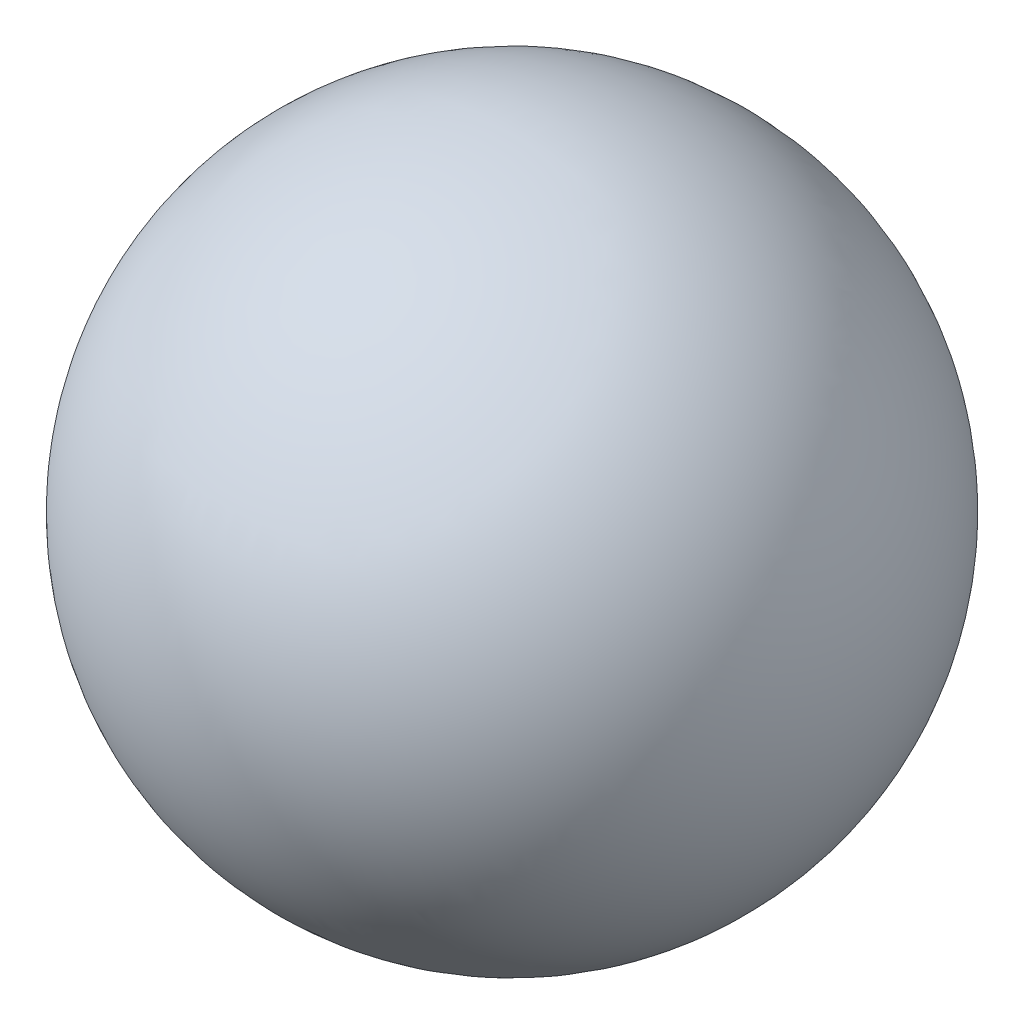
ISO-10303-21;
HEADER;
FILE_DESCRIPTION(('STEP AP214'),'2;1');
FILE_NAME('part.step','',(''),(''),'','','');
FILE_SCHEMA(('AUTOMOTIVE_DESIGN { 1 0 10303 214 1 1 1 1 }'));
ENDSEC;
DATA;
#1=APPLICATION_CONTEXT('core data for automotive mechanical design processes');
#2=APPLICATION_PROTOCOL_DEFINITION('international standard','automotive_design',2000,#1);
#3=PRODUCT_CONTEXT('',#1,'mechanical');
#4=PRODUCT('Part','Part','',(#3));
#5=PRODUCT_RELATED_PRODUCT_CATEGORY('part','',(#4));
#6=PRODUCT_DEFINITION_FORMATION('','',#4);
#7=PRODUCT_DEFINITION_CONTEXT('part definition',#1,'design');
#8=PRODUCT_DEFINITION('design','',#6,#7);
#9=PRODUCT_DEFINITION_SHAPE('','',#8);
#10=(LENGTH_UNIT() NAMED_UNIT(*) SI_UNIT(.MILLI.,.METRE.));
#11=(NAMED_UNIT(*) PLANE_ANGLE_UNIT() SI_UNIT($,.RADIAN.));
#12=(NAMED_UNIT(*) SI_UNIT($,.STERADIAN.) SOLID_ANGLE_UNIT());
#13=UNCERTAINTY_MEASURE_WITH_UNIT(LENGTH_MEASURE(1.E-05),#10,'distance_accuracy_value','');
#14=(GEOMETRIC_REPRESENTATION_CONTEXT(3) GLOBAL_UNCERTAINTY_ASSIGNED_CONTEXT((#13)) GLOBAL_UNIT_ASSIGNED_CONTEXT((#10,
#11,#12)) REPRESENTATION_CONTEXT('',''));
#15=CARTESIAN_POINT('',(0.,0.,0.));
#16=DIRECTION('',(0.,0.,1.));
#17=DIRECTION('',(1.,0.,0.));
#18=AXIS2_PLACEMENT_3D('',#15,#16,#17);
#19=CARTESIAN_POINT('',(-53.5,-27.0750130669611,0.));
#20=DIRECTION('',(0.,0.,-1.));
#21=DIRECTION('',(-0.00192681180953311,-0.999998143696402,0.));
#22=AXIS2_PLACEMENT_3D('',#19,#20,#21);
#23=CIRCLE('',#22,4.00000000000001);
#24=TRIMMED_CURVE('',#23,(PARAMETER_VALUE(-1.57418508211149)),
(PARAMETER_VALUE(1.57418508211149)),.T.,.PARAMETER.);
#25=CARTESIAN_POINT('',(-53.4999738820749,-27.0614580968005,0.));
#26=DIRECTION('',(-0.999998143696402,0.00192681180953311,0.));
#27=AXIS1_PLACEMENT('',#25,#26);
#28=SURFACE_OF_REVOLUTION('',#24,#27);
#29=CARTESIAN_POINT('',(-49.5000042745499,-27.0691652997849,0.));
#30=VERTEX_POINT('',#29);
#31=VERTEX_LOOP('',#30);
#32=FACE_BOUND('',#31,.T.);
#33=CARTESIAN_POINT('',(-57.4999434896,-27.053750893816,0.));
#34=VERTEX_POINT('',#33);
#35=VERTEX_LOOP('',#34);
#36=FACE_BOUND('',#35,.T.);
#37=ADVANCED_FACE('F32',(#32,#36),#28,.T.);
#38=CLOSED_SHELL('',(#37));
#39=MANIFOLD_SOLID_BREP('B2',#38);
#40=ADVANCED_BREP_SHAPE_REPRESENTATION('',(#18,#39),#14);
#41=SHAPE_DEFINITION_REPRESENTATION(#9,#40);
ENDSEC;
END-ISO-10303-21;
